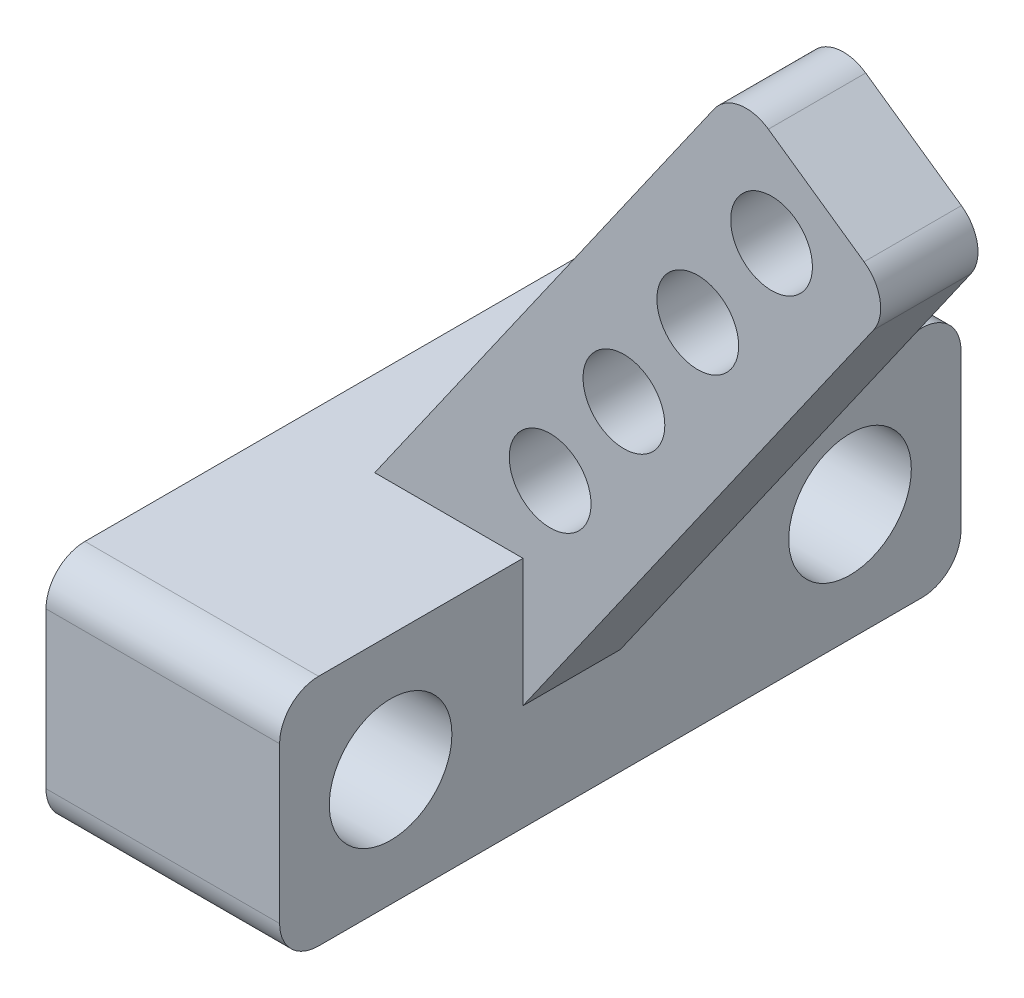
ISO-10303-21;
HEADER;
FILE_DESCRIPTION(('STEP AP214'),'2;1');
FILE_NAME('part.step','',(''),(''),'','','');
FILE_SCHEMA(('AUTOMOTIVE_DESIGN { 1 0 10303 214 1 1 1 1 }'));
ENDSEC;
DATA;
#1=APPLICATION_CONTEXT('core data for automotive mechanical design processes');
#2=APPLICATION_PROTOCOL_DEFINITION('international standard','automotive_design',2000,#1);
#3=PRODUCT_CONTEXT('',#1,'mechanical');
#4=PRODUCT('Part','Part','',(#3));
#5=PRODUCT_RELATED_PRODUCT_CATEGORY('part','',(#4));
#6=PRODUCT_DEFINITION_FORMATION('','',#4);
#7=PRODUCT_DEFINITION_CONTEXT('part definition',#1,'design');
#8=PRODUCT_DEFINITION('design','',#6,#7);
#9=PRODUCT_DEFINITION_SHAPE('','',#8);
#10=(LENGTH_UNIT() NAMED_UNIT(*) SI_UNIT(.MILLI.,.METRE.));
#11=(NAMED_UNIT(*) PLANE_ANGLE_UNIT() SI_UNIT($,.RADIAN.));
#12=(NAMED_UNIT(*) SI_UNIT($,.STERADIAN.) SOLID_ANGLE_UNIT());
#13=UNCERTAINTY_MEASURE_WITH_UNIT(LENGTH_MEASURE(1.E-05),#10,'distance_accuracy_value','');
#14=(GEOMETRIC_REPRESENTATION_CONTEXT(3) GLOBAL_UNCERTAINTY_ASSIGNED_CONTEXT((#13)) GLOBAL_UNIT_ASSIGNED_CONTEXT((#10,
#11,#12)) REPRESENTATION_CONTEXT('',''));
#15=CARTESIAN_POINT('',(0.,0.,0.));
#16=DIRECTION('',(0.,0.,1.));
#17=DIRECTION('',(1.,0.,0.));
#18=AXIS2_PLACEMENT_3D('',#15,#16,#17);
#19=CARTESIAN_POINT('',(12.,6.,0.));
#20=DIRECTION('',(0.,1.,0.));
#21=DIRECTION('',(0.,0.,1.));
#22=AXIS2_PLACEMENT_3D('',#19,#20,#21);
#23=PLANE('',#22);
#24=DIRECTION('',(0.,0.,-1.));
#25=VECTOR('',#24,1.);
#26=CARTESIAN_POINT('',(12.,6.,0.));
#27=LINE('',#26,#25);
#28=CARTESIAN_POINT('',(12.,6.,15.5));
#29=VERTEX_POINT('',#28);
#30=CARTESIAN_POINT('',(12.,6.,5.));
#31=VERTEX_POINT('',#30);
#32=EDGE_CURVE('E239',#29,#31,#27,.T.);
#33=ORIENTED_EDGE('',*,*,#32,.T.);
#34=DIRECTION('',(-1.,0.,0.));
#35=VECTOR('',#34,1.);
#36=CARTESIAN_POINT('',(12.,6.,5.));
#37=LINE('',#36,#35);
#38=CARTESIAN_POINT('',(4.38626501379187,5.99999999999999,5.));
#39=VERTEX_POINT('',#38);
#40=EDGE_CURVE('E170',#31,#39,#37,.T.);
#41=ORIENTED_EDGE('',*,*,#40,.T.);
#42=DIRECTION('',(0.,0.,-1.));
#43=VECTOR('',#42,1.);
#44=CARTESIAN_POINT('',(4.38626501379187,6.,0.));
#45=LINE('',#44,#43);
#46=CARTESIAN_POINT('',(4.38626501379187,5.99999999999999,0.));
#47=VERTEX_POINT('',#46);
#48=EDGE_CURVE('E515',#39,#47,#45,.T.);
#49=ORIENTED_EDGE('',*,*,#48,.T.);
#50=DIRECTION('',(-1.,0.,0.));
#51=VECTOR('',#50,1.);
#52=CARTESIAN_POINT('',(12.,6.,0.));
#53=LINE('',#52,#51);
#54=CARTESIAN_POINT('',(12.,6.,0.));
#55=VERTEX_POINT('',#54);
#56=EDGE_CURVE('E236',#55,#47,#53,.T.);
#57=ORIENTED_EDGE('',*,*,#56,.F.);
#58=CARTESIAN_POINT('',(12.,6.,-15.5));
#59=VERTEX_POINT('',#58);
#60=EDGE_CURVE('E232',#55,#59,#27,.T.);
#61=ORIENTED_EDGE('',*,*,#60,.T.);
#62=DIRECTION('',(-1.,0.,0.));
#63=VECTOR('',#62,1.);
#64=CARTESIAN_POINT('',(12.,6.,-15.5));
#65=LINE('',#64,#63);
#66=CARTESIAN_POINT('',(0.,6.,-15.5));
#67=VERTEX_POINT('',#66);
#68=EDGE_CURVE('E214',#59,#67,#65,.T.);
#69=ORIENTED_EDGE('',*,*,#68,.T.);
#70=DIRECTION('',(0.,0.,-1.));
#71=VECTOR('',#70,1.);
#72=CARTESIAN_POINT('',(0.,6.,0.));
#73=LINE('',#72,#71);
#74=CARTESIAN_POINT('',(0.,6.,15.5));
#75=VERTEX_POINT('',#74);
#76=EDGE_CURVE('E174',#75,#67,#73,.T.);
#77=ORIENTED_EDGE('',*,*,#76,.F.);
#78=DIRECTION('',(-1.,0.,0.));
#79=VECTOR('',#78,1.);
#80=CARTESIAN_POINT('',(12.,6.,15.5));
#81=LINE('',#80,#79);
#82=EDGE_CURVE('E211',#29,#75,#81,.T.);
#83=ORIENTED_EDGE('',*,*,#82,.F.);
#84=EDGE_LOOP('',(#33,#41,#49,#57,#61,#69,#77,#83));
#85=FACE_BOUND('',#84,.T.);
#86=ADVANCED_FACE('F39',(#85),#23,.T.);
#87=CARTESIAN_POINT('',(12.,0.,0.));
#88=DIRECTION('',(1.,0.,0.));
#89=DIRECTION('',(0.,0.,-1.));
#90=AXIS2_PLACEMENT_3D('',#87,#88,#89);
#91=PLANE('',#90);
#92=CARTESIAN_POINT('',(12.,0.,-11.8));
#93=DIRECTION('',(1.,0.,0.));
#94=DIRECTION('',(0.,0.,-1.));
#95=AXIS2_PLACEMENT_3D('',#92,#93,#94);
#96=CIRCLE('',#95,3.15);
#97=CARTESIAN_POINT('',(12.,0.,-14.95));
#98=VERTEX_POINT('',#97);
#99=EDGE_CURVE('E156',#98,#98,#96,.T.);
#100=ORIENTED_EDGE('',*,*,#99,.F.);
#101=EDGE_LOOP('',(#100));
#102=FACE_BOUND('',#101,.T.);
#103=CARTESIAN_POINT('',(12.,0.,11.8));
#104=DIRECTION('',(1.,0.,0.));
#105=DIRECTION('',(0.,0.,-1.));
#106=AXIS2_PLACEMENT_3D('',#103,#104,#105);
#107=CIRCLE('',#106,3.15);
#108=CARTESIAN_POINT('',(12.,0.,8.65));
#109=VERTEX_POINT('',#108);
#110=EDGE_CURVE('E160',#109,#109,#107,.T.);
#111=ORIENTED_EDGE('',*,*,#110,.F.);
#112=EDGE_LOOP('',(#111));
#113=FACE_BOUND('',#112,.T.);
#114=DIRECTION('',(0.,0.,1.));
#115=VECTOR('',#114,1.);
#116=CARTESIAN_POINT('',(12.,-0.560927511795138,0.));
#117=LINE('',#116,#115);
#118=CARTESIAN_POINT('',(12.,-0.56092751179514,0.));
#119=VERTEX_POINT('',#118);
#120=CARTESIAN_POINT('',(12.,-0.560927511795138,5.));
#121=VERTEX_POINT('',#120);
#122=EDGE_CURVE('E11',#119,#121,#117,.T.);
#123=ORIENTED_EDGE('',*,*,#122,.T.);
#124=DIRECTION('',(0.,1.,0.));
#125=VECTOR('',#124,1.);
#126=CARTESIAN_POINT('',(12.,0.,5.));
#127=LINE('',#126,#125);
#128=EDGE_CURVE('E524',#121,#31,#127,.T.);
#129=ORIENTED_EDGE('',*,*,#128,.T.);
#130=ORIENTED_EDGE('',*,*,#32,.F.);
#131=CARTESIAN_POINT('',(12.,4.,15.5));
#132=DIRECTION('',(1.,0.,0.));
#133=DIRECTION('',(0.,0.,-1.));
#134=AXIS2_PLACEMENT_3D('',#131,#132,#133);
#135=CIRCLE('',#134,2.);
#136=CARTESIAN_POINT('',(12.,3.99999999999998,17.5));
#137=VERTEX_POINT('',#136);
#138=EDGE_CURVE('E150',#137,#29,#135,.F.);
#139=ORIENTED_EDGE('',*,*,#138,.F.);
#140=DIRECTION('',(0.,1.,0.));
#141=VECTOR('',#140,1.);
#142=CARTESIAN_POINT('',(12.,0.,17.5));
#143=LINE('',#142,#141);
#144=CARTESIAN_POINT('',(12.,-3.99999999999999,17.5));
#145=VERTEX_POINT('',#144);
#146=EDGE_CURVE('E146',#145,#137,#143,.T.);
#147=ORIENTED_EDGE('',*,*,#146,.F.);
#148=CARTESIAN_POINT('',(12.,-4.,15.5));
#149=DIRECTION('',(1.,0.,0.));
#150=DIRECTION('',(0.,0.,-1.));
#151=AXIS2_PLACEMENT_3D('',#148,#149,#150);
#152=CIRCLE('',#151,2.);
#153=CARTESIAN_POINT('',(12.,-6.,15.5));
#154=VERTEX_POINT('',#153);
#155=EDGE_CURVE('E128',#154,#145,#152,.F.);
#156=ORIENTED_EDGE('',*,*,#155,.F.);
#157=DIRECTION('',(0.,0.,-1.));
#158=VECTOR('',#157,1.);
#159=CARTESIAN_POINT('',(12.,-6.,0.));
#160=LINE('',#159,#158);
#161=CARTESIAN_POINT('',(12.,-6.,-15.5));
#162=VERTEX_POINT('',#161);
#163=EDGE_CURVE('E138',#154,#162,#160,.T.);
#164=ORIENTED_EDGE('',*,*,#163,.T.);
#165=CARTESIAN_POINT('',(12.,-4.,-15.5));
#166=DIRECTION('',(1.,0.,0.));
#167=DIRECTION('',(0.,0.,-1.));
#168=AXIS2_PLACEMENT_3D('',#165,#166,#167);
#169=CIRCLE('',#168,2.);
#170=CARTESIAN_POINT('',(12.,-3.99999999999999,-17.5));
#171=VERTEX_POINT('',#170);
#172=EDGE_CURVE('E64',#162,#171,#169,.T.);
#173=ORIENTED_EDGE('',*,*,#172,.T.);
#174=DIRECTION('',(0.,1.,0.));
#175=VECTOR('',#174,1.);
#176=CARTESIAN_POINT('',(12.,0.,-17.5));
#177=LINE('',#176,#175);
#178=CARTESIAN_POINT('',(12.,3.99999999999999,-17.5));
#179=VERTEX_POINT('',#178);
#180=EDGE_CURVE('E201',#171,#179,#177,.T.);
#181=ORIENTED_EDGE('',*,*,#180,.T.);
#182=CARTESIAN_POINT('',(12.,4.,-15.5));
#183=DIRECTION('',(1.,0.,0.));
#184=DIRECTION('',(0.,0.,-1.));
#185=AXIS2_PLACEMENT_3D('',#182,#183,#184);
#186=CIRCLE('',#185,2.);
#187=EDGE_CURVE('E106',#179,#59,#186,.T.);
#188=ORIENTED_EDGE('',*,*,#187,.T.);
#189=ORIENTED_EDGE('',*,*,#60,.F.);
#190=DIRECTION('',(0.,1.,0.));
#191=VECTOR('',#190,1.);
#192=CARTESIAN_POINT('',(12.,0.,0.));
#193=LINE('',#192,#191);
#194=EDGE_CURVE('E518',#119,#55,#193,.T.);
#195=ORIENTED_EDGE('',*,*,#194,.F.);
#196=EDGE_LOOP('',(#123,#129,#130,#139,#147,#156,#164,#173,#181,#188,#189,#195));
#197=FACE_BOUND('',#196,.T.);
#198=ADVANCED_FACE('F143',(#102,#113,#197),#91,.T.);
#199=CARTESIAN_POINT('',(12.,0.,-17.5));
#200=DIRECTION('',(0.,0.,1.));
#201=DIRECTION('',(1.,0.,0.));
#202=AXIS2_PLACEMENT_3D('',#199,#200,#201);
#203=PLANE('',#202);
#204=DIRECTION('',(0.,1.,0.));
#205=VECTOR('',#204,1.);
#206=CARTESIAN_POINT('',(0.,0.,-17.5));
#207=LINE('',#206,#205);
#208=CARTESIAN_POINT('',(0.,-3.99999999999999,-17.5));
#209=VERTEX_POINT('',#208);
#210=CARTESIAN_POINT('',(0.,3.99999999999999,-17.5));
#211=VERTEX_POINT('',#210);
#212=EDGE_CURVE('E165',#209,#211,#207,.T.);
#213=ORIENTED_EDGE('',*,*,#212,.T.);
#214=DIRECTION('',(-1.,0.,0.));
#215=VECTOR('',#214,1.);
#216=CARTESIAN_POINT('',(12.,3.99999999999999,-17.5));
#217=LINE('',#216,#215);
#218=EDGE_CURVE('E48',#179,#211,#217,.T.);
#219=ORIENTED_EDGE('',*,*,#218,.F.);
#220=ORIENTED_EDGE('',*,*,#180,.F.);
#221=DIRECTION('',(-1.,0.,0.));
#222=VECTOR('',#221,1.);
#223=CARTESIAN_POINT('',(12.,-3.99999999999999,-17.5));
#224=LINE('',#223,#222);
#225=EDGE_CURVE('E164',#171,#209,#224,.T.);
#226=ORIENTED_EDGE('',*,*,#225,.T.);
#227=EDGE_LOOP('',(#213,#219,#220,#226));
#228=FACE_BOUND('',#227,.T.);
#229=ADVANCED_FACE('F41',(#228),#203,.F.);
#230=CARTESIAN_POINT('',(12.,4.,-15.5));
#231=DIRECTION('',(-1.,0.,0.));
#232=DIRECTION('',(0.,0.,1.));
#233=AXIS2_PLACEMENT_3D('',#230,#231,#232);
#234=CYLINDRICAL_SURFACE('',#233,2.);
#235=CARTESIAN_POINT('',(0.,4.,-15.5));
#236=DIRECTION('',(1.,0.,0.));
#237=DIRECTION('',(0.,0.,-1.));
#238=AXIS2_PLACEMENT_3D('',#235,#236,#237);
#239=CIRCLE('',#238,2.);
#240=EDGE_CURVE('E169',#211,#67,#239,.T.);
#241=ORIENTED_EDGE('',*,*,#240,.T.);
#242=ORIENTED_EDGE('',*,*,#68,.F.);
#243=ORIENTED_EDGE('',*,*,#187,.F.);
#244=ORIENTED_EDGE('',*,*,#218,.T.);
#245=EDGE_LOOP('',(#241,#242,#243,#244));
#246=FACE_BOUND('',#245,.T.);
#247=ADVANCED_FACE('F218',(#246),#234,.T.);
#248=CARTESIAN_POINT('',(12.,4.,15.5));
#249=DIRECTION('',(-1.,0.,0.));
#250=DIRECTION('',(0.,0.,1.));
#251=AXIS2_PLACEMENT_3D('',#248,#249,#250);
#252=CYLINDRICAL_SURFACE('',#251,2.);
#253=CARTESIAN_POINT('',(0.,4.,15.5));
#254=DIRECTION('',(1.,0.,0.));
#255=DIRECTION('',(0.,0.,-1.));
#256=AXIS2_PLACEMENT_3D('',#253,#254,#255);
#257=CIRCLE('',#256,2.);
#258=CARTESIAN_POINT('',(0.,3.99999999999998,17.5));
#259=VERTEX_POINT('',#258);
#260=EDGE_CURVE('E178',#259,#75,#257,.F.);
#261=ORIENTED_EDGE('',*,*,#260,.F.);
#262=DIRECTION('',(-1.,0.,0.));
#263=VECTOR('',#262,1.);
#264=CARTESIAN_POINT('',(12.,3.99999999999998,17.5));
#265=LINE('',#264,#263);
#266=EDGE_CURVE('E208',#137,#259,#265,.T.);
#267=ORIENTED_EDGE('',*,*,#266,.F.);
#268=ORIENTED_EDGE('',*,*,#138,.T.);
#269=ORIENTED_EDGE('',*,*,#82,.T.);
#270=EDGE_LOOP('',(#261,#267,#268,#269));
#271=FACE_BOUND('',#270,.T.);
#272=ADVANCED_FACE('F250',(#271),#252,.T.);
#273=CARTESIAN_POINT('',(12.,0.,17.5));
#274=DIRECTION('',(0.,0.,1.));
#275=DIRECTION('',(1.,0.,0.));
#276=AXIS2_PLACEMENT_3D('',#273,#274,#275);
#277=PLANE('',#276);
#278=DIRECTION('',(0.,1.,0.));
#279=VECTOR('',#278,1.);
#280=CARTESIAN_POINT('',(0.,0.,17.5));
#281=LINE('',#280,#279);
#282=CARTESIAN_POINT('',(0.,-3.99999999999999,17.5));
#283=VERTEX_POINT('',#282);
#284=EDGE_CURVE('E182',#283,#259,#281,.T.);
#285=ORIENTED_EDGE('',*,*,#284,.F.);
#286=DIRECTION('',(-1.,0.,0.));
#287=VECTOR('',#286,1.);
#288=CARTESIAN_POINT('',(12.,-3.99999999999999,17.5));
#289=LINE('',#288,#287);
#290=EDGE_CURVE('E134',#145,#283,#289,.T.);
#291=ORIENTED_EDGE('',*,*,#290,.F.);
#292=ORIENTED_EDGE('',*,*,#146,.T.);
#293=ORIENTED_EDGE('',*,*,#266,.T.);
#294=EDGE_LOOP('',(#285,#291,#292,#293));
#295=FACE_BOUND('',#294,.T.);
#296=ADVANCED_FACE('F254',(#295),#277,.T.);
#297=CARTESIAN_POINT('',(12.,-4.,15.5));
#298=DIRECTION('',(-1.,0.,0.));
#299=DIRECTION('',(0.,0.,1.));
#300=AXIS2_PLACEMENT_3D('',#297,#298,#299);
#301=CYLINDRICAL_SURFACE('',#300,2.);
#302=CARTESIAN_POINT('',(0.,-4.,15.5));
#303=DIRECTION('',(1.,0.,0.));
#304=DIRECTION('',(0.,0.,-1.));
#305=AXIS2_PLACEMENT_3D('',#302,#303,#304);
#306=CIRCLE('',#305,2.);
#307=CARTESIAN_POINT('',(0.,-6.,15.5));
#308=VERTEX_POINT('',#307);
#309=EDGE_CURVE('E130',#308,#283,#306,.F.);
#310=ORIENTED_EDGE('',*,*,#309,.F.);
#311=DIRECTION('',(-1.,0.,0.));
#312=VECTOR('',#311,1.);
#313=CARTESIAN_POINT('',(12.,-6.,15.5));
#314=LINE('',#313,#312);
#315=EDGE_CURVE('E124',#154,#308,#314,.T.);
#316=ORIENTED_EDGE('',*,*,#315,.F.);
#317=ORIENTED_EDGE('',*,*,#155,.T.);
#318=ORIENTED_EDGE('',*,*,#290,.T.);
#319=EDGE_LOOP('',(#310,#316,#317,#318));
#320=FACE_BOUND('',#319,.T.);
#321=ADVANCED_FACE('F126',(#320),#301,.T.);
#322=CARTESIAN_POINT('',(12.,-6.,0.));
#323=DIRECTION('',(0.,1.,0.));
#324=DIRECTION('',(0.,0.,1.));
#325=AXIS2_PLACEMENT_3D('',#322,#323,#324);
#326=PLANE('',#325);
#327=DIRECTION('',(0.,0.,-1.));
#328=VECTOR('',#327,1.);
#329=CARTESIAN_POINT('',(0.,-6.,0.));
#330=LINE('',#329,#328);
#331=CARTESIAN_POINT('',(0.,-6.,-15.5));
#332=VERTEX_POINT('',#331);
#333=EDGE_CURVE('E188',#308,#332,#330,.T.);
#334=ORIENTED_EDGE('',*,*,#333,.T.);
#335=DIRECTION('',(-1.,0.,0.));
#336=VECTOR('',#335,1.);
#337=CARTESIAN_POINT('',(12.,-6.,-15.5));
#338=LINE('',#337,#336);
#339=EDGE_CURVE('E135',#162,#332,#338,.T.);
#340=ORIENTED_EDGE('',*,*,#339,.F.);
#341=ORIENTED_EDGE('',*,*,#163,.F.);
#342=ORIENTED_EDGE('',*,*,#315,.T.);
#343=EDGE_LOOP('',(#334,#340,#341,#342));
#344=FACE_BOUND('',#343,.T.);
#345=ADVANCED_FACE('F139',(#344),#326,.F.);
#346=CARTESIAN_POINT('',(12.,0.,-11.8));
#347=DIRECTION('',(-1.,0.,0.));
#348=DIRECTION('',(0.,0.,1.));
#349=AXIS2_PLACEMENT_3D('',#346,#347,#348);
#350=CYLINDRICAL_SURFACE('',#349,3.15);
#351=ORIENTED_EDGE('',*,*,#99,.T.);
#352=EDGE_LOOP('',(#351));
#353=FACE_BOUND('',#352,.T.);
#354=CARTESIAN_POINT('',(0.,0.,-11.8));
#355=DIRECTION('',(1.,0.,0.));
#356=DIRECTION('',(0.,0.,-1.));
#357=AXIS2_PLACEMENT_3D('',#354,#355,#356);
#358=CIRCLE('',#357,3.15);
#359=CARTESIAN_POINT('',(0.,0.,-14.95));
#360=VERTEX_POINT('',#359);
#361=EDGE_CURVE('E193',#360,#360,#358,.T.);
#362=ORIENTED_EDGE('',*,*,#361,.F.);
#363=EDGE_LOOP('',(#362));
#364=FACE_BOUND('',#363,.T.);
#365=ADVANCED_FACE('F258',(#353,#364),#350,.F.);
#366=CARTESIAN_POINT('',(12.,-4.,-15.5));
#367=DIRECTION('',(-1.,0.,0.));
#368=DIRECTION('',(0.,0.,1.));
#369=AXIS2_PLACEMENT_3D('',#366,#367,#368);
#370=CYLINDRICAL_SURFACE('',#369,2.);
#371=CARTESIAN_POINT('',(0.,-4.,-15.5));
#372=DIRECTION('',(1.,0.,0.));
#373=DIRECTION('',(0.,0.,-1.));
#374=AXIS2_PLACEMENT_3D('',#371,#372,#373);
#375=CIRCLE('',#374,2.);
#376=EDGE_CURVE('E97',#332,#209,#375,.T.);
#377=ORIENTED_EDGE('',*,*,#376,.T.);
#378=ORIENTED_EDGE('',*,*,#225,.F.);
#379=ORIENTED_EDGE('',*,*,#172,.F.);
#380=ORIENTED_EDGE('',*,*,#339,.T.);
#381=EDGE_LOOP('',(#377,#378,#379,#380));
#382=FACE_BOUND('',#381,.T.);
#383=ADVANCED_FACE('F255',(#382),#370,.T.);
#384=CARTESIAN_POINT('',(12.,0.,11.8));
#385=DIRECTION('',(-1.,0.,0.));
#386=DIRECTION('',(0.,0.,1.));
#387=AXIS2_PLACEMENT_3D('',#384,#385,#386);
#388=CYLINDRICAL_SURFACE('',#387,3.15);
#389=ORIENTED_EDGE('',*,*,#110,.T.);
#390=EDGE_LOOP('',(#389));
#391=FACE_BOUND('',#390,.T.);
#392=CARTESIAN_POINT('',(0.,0.,11.8));
#393=DIRECTION('',(1.,0.,0.));
#394=DIRECTION('',(0.,0.,-1.));
#395=AXIS2_PLACEMENT_3D('',#392,#393,#394);
#396=CIRCLE('',#395,3.15);
#397=CARTESIAN_POINT('',(0.,0.,8.65));
#398=VERTEX_POINT('',#397);
#399=EDGE_CURVE('E197',#398,#398,#396,.T.);
#400=ORIENTED_EDGE('',*,*,#399,.F.);
#401=EDGE_LOOP('',(#400));
#402=FACE_BOUND('',#401,.T.);
#403=ADVANCED_FACE('F257',(#391,#402),#388,.F.);
#404=CARTESIAN_POINT('',(0.,0.,0.));
#405=DIRECTION('',(1.,0.,0.));
#406=DIRECTION('',(0.,0.,-1.));
#407=AXIS2_PLACEMENT_3D('',#404,#405,#406);
#408=PLANE('',#407);
#409=ORIENTED_EDGE('',*,*,#212,.F.);
#410=ORIENTED_EDGE('',*,*,#376,.F.);
#411=ORIENTED_EDGE('',*,*,#333,.F.);
#412=ORIENTED_EDGE('',*,*,#309,.T.);
#413=ORIENTED_EDGE('',*,*,#284,.T.);
#414=ORIENTED_EDGE('',*,*,#260,.T.);
#415=ORIENTED_EDGE('',*,*,#76,.T.);
#416=ORIENTED_EDGE('',*,*,#240,.F.);
#417=EDGE_LOOP('',(#409,#410,#411,#412,#413,#414,#415,#416));
#418=FACE_BOUND('',#417,.T.);
#419=ORIENTED_EDGE('',*,*,#361,.T.);
#420=EDGE_LOOP('',(#419));
#421=FACE_BOUND('',#420,.T.);
#422=ORIENTED_EDGE('',*,*,#399,.T.);
#423=EDGE_LOOP('',(#422));
#424=FACE_BOUND('',#423,.T.);
#425=ADVANCED_FACE('F223',(#418,#421,#424),#408,.F.);
#426=CARTESIAN_POINT('',(23.4596058680783,29.75266013172,5.));
#427=DIRECTION('',(0.,0.,-1.));
#428=DIRECTION('',(-1.,0.,0.));
#429=AXIS2_PLACEMENT_3D('',#426,#427,#428);
#430=PLANE('',#429);
#431=ORIENTED_EDGE('',*,*,#40,.F.);
#432=ORIENTED_EDGE('',*,*,#128,.F.);
#433=DIRECTION('',(0.573576436351045,0.819152044288993,0.));
#434=VECTOR('',#433,1.);
#435=CARTESIAN_POINT('',(30.0128222223903,25.1640486409117,5.));
#436=LINE('',#435,#434);
#437=CARTESIAN_POINT('',(30.0128222223903,25.1640486409117,5.));
#438=VERTEX_POINT('',#437);
#439=EDGE_CURVE('E55',#121,#438,#436,.T.);
#440=ORIENTED_EDGE('',*,*,#439,.T.);
#441=CARTESIAN_POINT('',(28.3745181338123,26.3112015136138,5.));
#442=DIRECTION('',(0.,0.,1.));
#443=DIRECTION('',(1.,0.,0.));
#444=AXIS2_PLACEMENT_3D('',#441,#442,#443);
#445=CIRCLE('',#444,2.);
#446=CARTESIAN_POINT('',(29.5216710065144,27.9495056021917,5.));
#447=VERTEX_POINT('',#446);
#448=EDGE_CURVE('E464',#438,#447,#445,.T.);
#449=ORIENTED_EDGE('',*,*,#448,.T.);
#450=DIRECTION('',(-0.819152044288993,0.573576436351045,0.));
#451=VECTOR('',#450,1.);
#452=CARTESIAN_POINT('',(29.5216710065144,27.9495056021917,5.));
#453=LINE('',#452,#451);
#454=CARTESIAN_POINT('',(24.6067587407804,31.390964220298,5.));
#455=VERTEX_POINT('',#454);
#456=EDGE_CURVE('E469',#447,#455,#453,.T.);
#457=ORIENTED_EDGE('',*,*,#456,.T.);
#458=CARTESIAN_POINT('',(23.4596058680783,29.75266013172,5.));
#459=DIRECTION('',(0.,0.,1.));
#460=DIRECTION('',(-1.,0.,0.));
#461=AXIS2_PLACEMENT_3D('',#458,#459,#460);
#462=CIRCLE('',#461,2.);
#463=CARTESIAN_POINT('',(21.8213017795003,30.8998130044221,5.));
#464=VERTEX_POINT('',#463);
#465=EDGE_CURVE('E473',#455,#464,#462,.T.);
#466=ORIENTED_EDGE('',*,*,#465,.T.);
#467=DIRECTION('',(-0.573576436351045,-0.819152044288993,0.));
#468=VECTOR('',#467,1.);
#469=CARTESIAN_POINT('',(21.8213017795003,30.8998130044221,5.));
#470=LINE('',#469,#468);
#471=EDGE_CURVE('E477',#464,#39,#470,.T.);
#472=ORIENTED_EDGE('',*,*,#471,.T.);
#473=EDGE_LOOP('',(#431,#432,#440,#449,#457,#466,#472));
#474=FACE_BOUND('',#473,.T.);
#475=CARTESIAN_POINT('',(17.1872286396824,15.5644367085884,5.));
#476=DIRECTION('',(0.,0.,1.));
#477=DIRECTION('',(1.,0.,0.));
#478=AXIS2_PLACEMENT_3D('',#475,#476,#477);
#479=CIRCLE('',#478,2.1);
#480=CARTESIAN_POINT('',(19.2872286396824,15.5644367085884,5.));
#481=VERTEX_POINT('',#480);
#482=EDGE_CURVE('E454',#481,#481,#479,.T.);
#483=ORIENTED_EDGE('',*,*,#482,.F.);
#484=EDGE_LOOP('',(#483));
#485=FACE_BOUND('',#484,.T.);
#486=CARTESIAN_POINT('',(24.7699091282432,26.3936267340889,5.));
#487=DIRECTION('',(0.,0.,1.));
#488=DIRECTION('',(1.,0.,0.));
#489=AXIS2_PLACEMENT_3D('',#486,#487,#488);
#490=CIRCLE('',#489,2.1);
#491=CARTESIAN_POINT('',(26.8699091282432,26.3936267340889,5.));
#492=VERTEX_POINT('',#491);
#493=EDGE_CURVE('E446',#492,#492,#490,.T.);
#494=ORIENTED_EDGE('',*,*,#493,.F.);
#495=EDGE_LOOP('',(#494));
#496=FACE_BOUND('',#495,.T.);
#497=CARTESIAN_POINT('',(20.9785688839628,20.9790317213387,5.));
#498=DIRECTION('',(0.,0.,1.));
#499=DIRECTION('',(1.,0.,0.));
#500=AXIS2_PLACEMENT_3D('',#497,#498,#499);
#501=CIRCLE('',#500,2.1);
#502=CARTESIAN_POINT('',(23.0785688839628,20.9790317213387,5.));
#503=VERTEX_POINT('',#502);
#504=EDGE_CURVE('E438',#503,#503,#501,.T.);
#505=ORIENTED_EDGE('',*,*,#504,.F.);
#506=EDGE_LOOP('',(#505));
#507=FACE_BOUND('',#506,.T.);
#508=CARTESIAN_POINT('',(13.395888395402,10.1498416958382,5.));
#509=DIRECTION('',(0.,0.,1.));
#510=DIRECTION('',(1.,0.,0.));
#511=AXIS2_PLACEMENT_3D('',#508,#509,#510);
#512=CIRCLE('',#511,2.1);
#513=CARTESIAN_POINT('',(15.495888395402,10.1498416958382,5.));
#514=VERTEX_POINT('',#513);
#515=EDGE_CURVE('E427',#514,#514,#512,.T.);
#516=ORIENTED_EDGE('',*,*,#515,.F.);
#517=EDGE_LOOP('',(#516));
#518=FACE_BOUND('',#517,.T.);
#519=ADVANCED_FACE('F311',(#474,#485,#496,#507,#518),#430,.F.);
#520=CARTESIAN_POINT('',(23.4596058680783,29.75266013172,0.));
#521=DIRECTION('',(0.,0.,-1.));
#522=DIRECTION('',(-1.,0.,0.));
#523=AXIS2_PLACEMENT_3D('',#520,#521,#522);
#524=PLANE('',#523);
#525=CARTESIAN_POINT('',(20.9785688839628,20.9790317213387,0.));
#526=DIRECTION('',(0.,0.,1.));
#527=DIRECTION('',(1.,0.,0.));
#528=AXIS2_PLACEMENT_3D('',#525,#526,#527);
#529=CIRCLE('',#528,2.1);
#530=CARTESIAN_POINT('',(23.0785688839628,20.9790317213387,0.));
#531=VERTEX_POINT('',#530);
#532=EDGE_CURVE('E435',#531,#531,#529,.T.);
#533=ORIENTED_EDGE('',*,*,#532,.T.);
#534=EDGE_LOOP('',(#533));
#535=FACE_BOUND('',#534,.T.);
#536=CARTESIAN_POINT('',(17.1872286396824,15.5644367085884,0.));
#537=DIRECTION('',(0.,0.,1.));
#538=DIRECTION('',(1.,0.,0.));
#539=AXIS2_PLACEMENT_3D('',#536,#537,#538);
#540=CIRCLE('',#539,2.1);
#541=CARTESIAN_POINT('',(19.2872286396824,15.5644367085884,0.));
#542=VERTEX_POINT('',#541);
#543=EDGE_CURVE('E450',#542,#542,#540,.T.);
#544=ORIENTED_EDGE('',*,*,#543,.T.);
#545=EDGE_LOOP('',(#544));
#546=FACE_BOUND('',#545,.T.);
#547=ORIENTED_EDGE('',*,*,#194,.T.);
#548=ORIENTED_EDGE('',*,*,#56,.T.);
#549=DIRECTION('',(-0.573576436351045,-0.819152044288993,0.));
#550=VECTOR('',#549,1.);
#551=CARTESIAN_POINT('',(21.8213017795003,30.8998130044221,0.));
#552=LINE('',#551,#550);
#553=CARTESIAN_POINT('',(21.8213017795003,30.8998130044221,0.));
#554=VERTEX_POINT('',#553);
#555=EDGE_CURVE('E465',#554,#47,#552,.T.);
#556=ORIENTED_EDGE('',*,*,#555,.F.);
#557=CARTESIAN_POINT('',(23.4596058680783,29.75266013172,0.));
#558=DIRECTION('',(0.,0.,1.));
#559=DIRECTION('',(-1.,0.,0.));
#560=AXIS2_PLACEMENT_3D('',#557,#558,#559);
#561=CIRCLE('',#560,2.);
#562=CARTESIAN_POINT('',(24.6067587407804,31.390964220298,0.));
#563=VERTEX_POINT('',#562);
#564=EDGE_CURVE('E493',#563,#554,#561,.T.);
#565=ORIENTED_EDGE('',*,*,#564,.F.);
#566=DIRECTION('',(-0.819152044288993,0.573576436351045,0.));
#567=VECTOR('',#566,1.);
#568=CARTESIAN_POINT('',(29.5216710065144,27.9495056021917,0.));
#569=LINE('',#568,#567);
#570=CARTESIAN_POINT('',(29.5216710065144,27.9495056021917,0.));
#571=VERTEX_POINT('',#570);
#572=EDGE_CURVE('E489',#571,#563,#569,.T.);
#573=ORIENTED_EDGE('',*,*,#572,.F.);
#574=CARTESIAN_POINT('',(28.3745181338123,26.3112015136138,0.));
#575=DIRECTION('',(0.,0.,1.));
#576=DIRECTION('',(1.,0.,0.));
#577=AXIS2_PLACEMENT_3D('',#574,#575,#576);
#578=CIRCLE('',#577,2.);
#579=CARTESIAN_POINT('',(30.0128222223903,25.1640486409117,0.));
#580=VERTEX_POINT('',#579);
#581=EDGE_CURVE('E485',#580,#571,#578,.T.);
#582=ORIENTED_EDGE('',*,*,#581,.F.);
#583=DIRECTION('',(0.573576436351045,0.819152044288993,0.));
#584=VECTOR('',#583,1.);
#585=CARTESIAN_POINT('',(30.0128222223903,25.1640486409117,0.));
#586=LINE('',#585,#584);
#587=EDGE_CURVE('E458',#119,#580,#586,.T.);
#588=ORIENTED_EDGE('',*,*,#587,.F.);
#589=EDGE_LOOP('',(#547,#548,#556,#565,#573,#582,#588));
#590=FACE_BOUND('',#589,.T.);
#591=CARTESIAN_POINT('',(24.7699091282432,26.3936267340889,0.));
#592=DIRECTION('',(0.,0.,1.));
#593=DIRECTION('',(1.,0.,0.));
#594=AXIS2_PLACEMENT_3D('',#591,#592,#593);
#595=CIRCLE('',#594,2.1);
#596=CARTESIAN_POINT('',(26.8699091282432,26.3936267340889,0.));
#597=VERTEX_POINT('',#596);
#598=EDGE_CURVE('E442',#597,#597,#595,.T.);
#599=ORIENTED_EDGE('',*,*,#598,.T.);
#600=EDGE_LOOP('',(#599));
#601=FACE_BOUND('',#600,.T.);
#602=CARTESIAN_POINT('',(13.395888395402,10.1498416958382,0.));
#603=DIRECTION('',(0.,0.,1.));
#604=DIRECTION('',(1.,0.,0.));
#605=AXIS2_PLACEMENT_3D('',#602,#603,#604);
#606=CIRCLE('',#605,2.1);
#607=CARTESIAN_POINT('',(15.495888395402,10.1498416958382,0.));
#608=VERTEX_POINT('',#607);
#609=EDGE_CURVE('E430',#608,#608,#606,.T.);
#610=ORIENTED_EDGE('',*,*,#609,.T.);
#611=EDGE_LOOP('',(#610));
#612=FACE_BOUND('',#611,.T.);
#613=ADVANCED_FACE('F321',(#535,#546,#590,#601,#612),#524,.T.);
#614=CARTESIAN_POINT('',(30.0128222223903,25.1640486409117,5.));
#615=DIRECTION('',(-0.819152044288992,0.573576436351045,0.));
#616=DIRECTION('',(-0.573576436351045,-0.819152044288993,0.));
#617=AXIS2_PLACEMENT_3D('',#614,#615,#616);
#618=PLANE('',#617);
#619=ORIENTED_EDGE('',*,*,#122,.F.);
#620=ORIENTED_EDGE('',*,*,#587,.T.);
#621=DIRECTION('',(0.,0.,-1.));
#622=VECTOR('',#621,1.);
#623=CARTESIAN_POINT('',(30.0128222223903,25.1640486409117,5.));
#624=LINE('',#623,#622);
#625=EDGE_CURVE('E511',#438,#580,#624,.T.);
#626=ORIENTED_EDGE('',*,*,#625,.F.);
#627=ORIENTED_EDGE('',*,*,#439,.F.);
#628=EDGE_LOOP('',(#619,#620,#626,#627));
#629=FACE_BOUND('',#628,.T.);
#630=ADVANCED_FACE('F331',(#629),#618,.F.);
#631=CARTESIAN_POINT('',(28.3745181338123,26.3112015136138,5.));
#632=DIRECTION('',(0.,0.,-1.));
#633=DIRECTION('',(-1.,0.,0.));
#634=AXIS2_PLACEMENT_3D('',#631,#632,#633);
#635=CYLINDRICAL_SURFACE('',#634,2.);
#636=ORIENTED_EDGE('',*,*,#581,.T.);
#637=DIRECTION('',(0.,0.,-1.));
#638=VECTOR('',#637,1.);
#639=CARTESIAN_POINT('',(29.5216710065144,27.9495056021917,5.));
#640=LINE('',#639,#638);
#641=EDGE_CURVE('E507',#447,#571,#640,.T.);
#642=ORIENTED_EDGE('',*,*,#641,.F.);
#643=ORIENTED_EDGE('',*,*,#448,.F.);
#644=ORIENTED_EDGE('',*,*,#625,.T.);
#645=EDGE_LOOP('',(#636,#642,#643,#644));
#646=FACE_BOUND('',#645,.T.);
#647=ADVANCED_FACE('F341',(#646),#635,.T.);
#648=CARTESIAN_POINT('',(29.5216710065144,27.9495056021917,5.));
#649=DIRECTION('',(-0.573576436351045,-0.819152044288993,0.));
#650=DIRECTION('',(0.819152044288993,-0.573576436351045,0.));
#651=AXIS2_PLACEMENT_3D('',#648,#649,#650);
#652=PLANE('',#651);
#653=ORIENTED_EDGE('',*,*,#572,.T.);
#654=DIRECTION('',(0.,0.,-1.));
#655=VECTOR('',#654,1.);
#656=CARTESIAN_POINT('',(24.6067587407804,31.390964220298,5.));
#657=LINE('',#656,#655);
#658=EDGE_CURVE('E503',#455,#563,#657,.T.);
#659=ORIENTED_EDGE('',*,*,#658,.F.);
#660=ORIENTED_EDGE('',*,*,#456,.F.);
#661=ORIENTED_EDGE('',*,*,#641,.T.);
#662=EDGE_LOOP('',(#653,#659,#660,#661));
#663=FACE_BOUND('',#662,.T.);
#664=ADVANCED_FACE('F350',(#663),#652,.F.);
#665=CARTESIAN_POINT('',(23.4596058680783,29.75266013172,5.));
#666=DIRECTION('',(0.,0.,-1.));
#667=DIRECTION('',(-1.,0.,0.));
#668=AXIS2_PLACEMENT_3D('',#665,#666,#667);
#669=CYLINDRICAL_SURFACE('',#668,2.);
#670=ORIENTED_EDGE('',*,*,#564,.T.);
#671=DIRECTION('',(0.,0.,-1.));
#672=VECTOR('',#671,1.);
#673=CARTESIAN_POINT('',(21.8213017795003,30.8998130044221,5.));
#674=LINE('',#673,#672);
#675=EDGE_CURVE('E481',#464,#554,#674,.T.);
#676=ORIENTED_EDGE('',*,*,#675,.F.);
#677=ORIENTED_EDGE('',*,*,#465,.F.);
#678=ORIENTED_EDGE('',*,*,#658,.T.);
#679=EDGE_LOOP('',(#670,#676,#677,#678));
#680=FACE_BOUND('',#679,.T.);
#681=ADVANCED_FACE('F360',(#680),#669,.T.);
#682=CARTESIAN_POINT('',(21.8213017795003,30.8998130044221,5.));
#683=DIRECTION('',(0.819152044288993,-0.573576436351045,0.));
#684=DIRECTION('',(0.573576436351045,0.819152044288993,0.));
#685=AXIS2_PLACEMENT_3D('',#682,#683,#684);
#686=PLANE('',#685);
#687=ORIENTED_EDGE('',*,*,#48,.F.);
#688=ORIENTED_EDGE('',*,*,#471,.F.);
#689=ORIENTED_EDGE('',*,*,#675,.T.);
#690=ORIENTED_EDGE('',*,*,#555,.T.);
#691=EDGE_LOOP('',(#687,#688,#689,#690));
#692=FACE_BOUND('',#691,.T.);
#693=ADVANCED_FACE('F370',(#692),#686,.F.);
#694=CARTESIAN_POINT('',(17.1872286396824,15.5644367085884,5.));
#695=DIRECTION('',(0.,0.,-1.));
#696=DIRECTION('',(-1.,0.,0.));
#697=AXIS2_PLACEMENT_3D('',#694,#695,#696);
#698=CYLINDRICAL_SURFACE('',#697,2.1);
#699=ORIENTED_EDGE('',*,*,#482,.T.);
#700=EDGE_LOOP('',(#699));
#701=FACE_BOUND('',#700,.T.);
#702=ORIENTED_EDGE('',*,*,#543,.F.);
#703=EDGE_LOOP('',(#702));
#704=FACE_BOUND('',#703,.T.);
#705=ADVANCED_FACE('F380',(#701,#704),#698,.F.);
#706=CARTESIAN_POINT('',(24.7699091282432,26.3936267340889,5.));
#707=DIRECTION('',(0.,0.,-1.));
#708=DIRECTION('',(-1.,0.,0.));
#709=AXIS2_PLACEMENT_3D('',#706,#707,#708);
#710=CYLINDRICAL_SURFACE('',#709,2.1);
#711=ORIENTED_EDGE('',*,*,#493,.T.);
#712=EDGE_LOOP('',(#711));
#713=FACE_BOUND('',#712,.T.);
#714=ORIENTED_EDGE('',*,*,#598,.F.);
#715=EDGE_LOOP('',(#714));
#716=FACE_BOUND('',#715,.T.);
#717=ADVANCED_FACE('F390',(#713,#716),#710,.F.);
#718=CARTESIAN_POINT('',(20.9785688839628,20.9790317213387,5.));
#719=DIRECTION('',(0.,0.,-1.));
#720=DIRECTION('',(-1.,0.,0.));
#721=AXIS2_PLACEMENT_3D('',#718,#719,#720);
#722=CYLINDRICAL_SURFACE('',#721,2.1);
#723=ORIENTED_EDGE('',*,*,#504,.T.);
#724=EDGE_LOOP('',(#723));
#725=FACE_BOUND('',#724,.T.);
#726=ORIENTED_EDGE('',*,*,#532,.F.);
#727=EDGE_LOOP('',(#726));
#728=FACE_BOUND('',#727,.T.);
#729=ADVANCED_FACE('F400',(#725,#728),#722,.F.);
#730=CARTESIAN_POINT('',(13.395888395402,10.1498416958382,5.));
#731=DIRECTION('',(0.,0.,-1.));
#732=DIRECTION('',(-1.,0.,0.));
#733=AXIS2_PLACEMENT_3D('',#730,#731,#732);
#734=CYLINDRICAL_SURFACE('',#733,2.1);
#735=ORIENTED_EDGE('',*,*,#515,.T.);
#736=EDGE_LOOP('',(#735));
#737=FACE_BOUND('',#736,.T.);
#738=ORIENTED_EDGE('',*,*,#609,.F.);
#739=EDGE_LOOP('',(#738));
#740=FACE_BOUND('',#739,.T.);
#741=ADVANCED_FACE('F410',(#737,#740),#734,.F.);
#742=CLOSED_SHELL('',(#86,#198,#229,#247,#272,#296,#321,#345,#365,#383,#403,#425,#519,#613,#630,
#647,#664,#681,#693,#705,#717,#729,#741));
#743=MANIFOLD_SOLID_BREP('B2',#742);
#744=ADVANCED_BREP_SHAPE_REPRESENTATION('',(#18,#743),#14);
#745=SHAPE_DEFINITION_REPRESENTATION(#9,#744);
ENDSEC;
END-ISO-10303-21;
